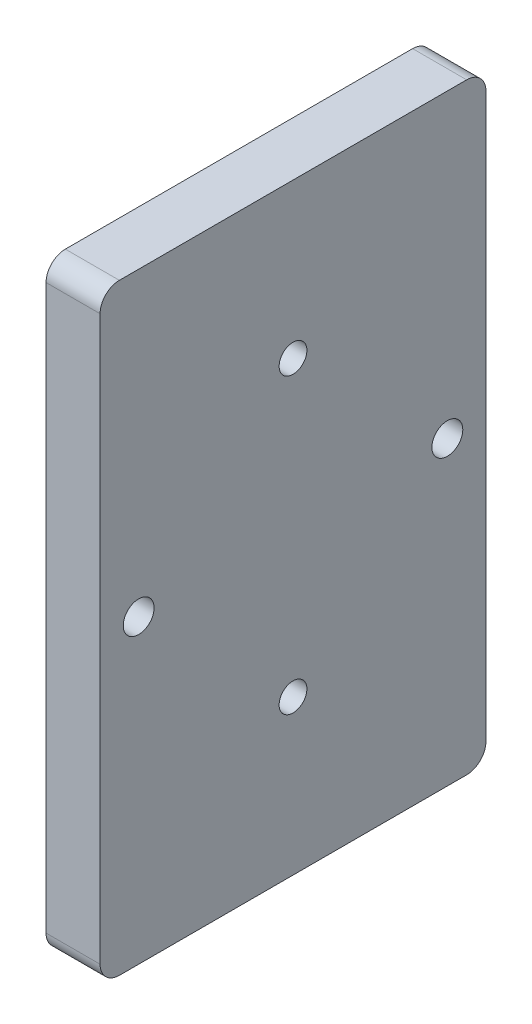
ISO-10303-21;
HEADER;
FILE_DESCRIPTION(('STEP AP214'),'2;1');
FILE_NAME('part.step','',(''),(''),'','','');
FILE_SCHEMA(('AUTOMOTIVE_DESIGN { 1 0 10303 214 1 1 1 1 }'));
ENDSEC;
DATA;
#1=APPLICATION_CONTEXT('core data for automotive mechanical design processes');
#2=APPLICATION_PROTOCOL_DEFINITION('international standard','automotive_design',2000,#1);
#3=PRODUCT_CONTEXT('',#1,'mechanical');
#4=PRODUCT('Part','Part','',(#3));
#5=PRODUCT_RELATED_PRODUCT_CATEGORY('part','',(#4));
#6=PRODUCT_DEFINITION_FORMATION('','',#4);
#7=PRODUCT_DEFINITION_CONTEXT('part definition',#1,'design');
#8=PRODUCT_DEFINITION('design','',#6,#7);
#9=PRODUCT_DEFINITION_SHAPE('','',#8);
#10=(LENGTH_UNIT() NAMED_UNIT(*) SI_UNIT(.MILLI.,.METRE.));
#11=(NAMED_UNIT(*) PLANE_ANGLE_UNIT() SI_UNIT($,.RADIAN.));
#12=(NAMED_UNIT(*) SI_UNIT($,.STERADIAN.) SOLID_ANGLE_UNIT());
#13=UNCERTAINTY_MEASURE_WITH_UNIT(LENGTH_MEASURE(1.E-05),#10,'distance_accuracy_value','');
#14=(GEOMETRIC_REPRESENTATION_CONTEXT(3) GLOBAL_UNCERTAINTY_ASSIGNED_CONTEXT((#13)) GLOBAL_UNIT_ASSIGNED_CONTEXT((#10,
#11,#12)) REPRESENTATION_CONTEXT('',''));
#15=CARTESIAN_POINT('',(0.,0.,0.));
#16=DIRECTION('',(0.,0.,1.));
#17=DIRECTION('',(1.,0.,0.));
#18=AXIS2_PLACEMENT_3D('',#15,#16,#17);
#19=CARTESIAN_POINT('',(14.,0.,0.));
#20=DIRECTION('',(0.,-1.,0.));
#21=DIRECTION('',(0.,0.,-1.));
#22=AXIS2_PLACEMENT_3D('',#19,#20,#21);
#23=PLANE('',#22);
#24=DIRECTION('',(0.,0.,1.));
#25=VECTOR('',#24,1.);
#26=CARTESIAN_POINT('',(14.,0.,0.));
#27=LINE('',#26,#25);
#28=CARTESIAN_POINT('',(14.,0.,-95.));
#29=VERTEX_POINT('',#28);
#30=CARTESIAN_POINT('',(14.,0.,-5.));
#31=VERTEX_POINT('',#30);
#32=EDGE_CURVE('E155',#29,#31,#27,.T.);
#33=ORIENTED_EDGE('',*,*,#32,.T.);
#34=DIRECTION('',(-1.,0.,0.));
#35=VECTOR('',#34,1.);
#36=CARTESIAN_POINT('',(14.,0.,-5.));
#37=LINE('',#36,#35);
#38=CARTESIAN_POINT('',(0.,0.,-5.));
#39=VERTEX_POINT('',#38);
#40=EDGE_CURVE('E11',#31,#39,#37,.T.);
#41=ORIENTED_EDGE('',*,*,#40,.T.);
#42=DIRECTION('',(0.,0.,1.));
#43=VECTOR('',#42,1.);
#44=CARTESIAN_POINT('',(0.,0.,0.));
#45=LINE('',#44,#43);
#46=CARTESIAN_POINT('',(0.,0.,-95.));
#47=VERTEX_POINT('',#46);
#48=EDGE_CURVE('E158',#47,#39,#45,.T.);
#49=ORIENTED_EDGE('',*,*,#48,.F.);
#50=DIRECTION('',(-1.,0.,0.));
#51=VECTOR('',#50,1.);
#52=CARTESIAN_POINT('',(14.,0.,-95.));
#53=LINE('',#52,#51);
#54=EDGE_CURVE('E43',#47,#29,#53,.F.);
#55=ORIENTED_EDGE('',*,*,#54,.T.);
#56=EDGE_LOOP('',(#33,#41,#49,#55));
#57=FACE_BOUND('',#56,.T.);
#58=ADVANCED_FACE('F35',(#57),#23,.T.);
#59=CARTESIAN_POINT('',(14.,0.,-100.));
#60=DIRECTION('',(0.,0.,-1.));
#61=DIRECTION('',(0.,1.,0.));
#62=AXIS2_PLACEMENT_3D('',#59,#60,#61);
#63=PLANE('',#62);
#64=DIRECTION('',(0.,-1.,0.));
#65=VECTOR('',#64,1.);
#66=CARTESIAN_POINT('',(0.,0.,-100.));
#67=LINE('',#66,#65);
#68=CARTESIAN_POINT('',(0.,151.,-100.));
#69=VERTEX_POINT('',#68);
#70=CARTESIAN_POINT('',(0.,5.00000000000001,-100.));
#71=VERTEX_POINT('',#70);
#72=EDGE_CURVE('E121',#69,#71,#67,.T.);
#73=ORIENTED_EDGE('',*,*,#72,.F.);
#74=DIRECTION('',(-1.,0.,0.));
#75=VECTOR('',#74,1.);
#76=CARTESIAN_POINT('',(14.,151.,-100.));
#77=LINE('',#76,#75);
#78=CARTESIAN_POINT('',(14.,151.,-100.));
#79=VERTEX_POINT('',#78);
#80=EDGE_CURVE('E139',#69,#79,#77,.F.);
#81=ORIENTED_EDGE('',*,*,#80,.T.);
#82=DIRECTION('',(0.,-1.,0.));
#83=VECTOR('',#82,1.);
#84=CARTESIAN_POINT('',(14.,0.,-100.));
#85=LINE('',#84,#83);
#86=CARTESIAN_POINT('',(14.,5.00000000000001,-100.));
#87=VERTEX_POINT('',#86);
#88=EDGE_CURVE('E166',#79,#87,#85,.T.);
#89=ORIENTED_EDGE('',*,*,#88,.T.);
#90=DIRECTION('',(-1.,0.,0.));
#91=VECTOR('',#90,1.);
#92=CARTESIAN_POINT('',(14.,5.00000000000001,-100.));
#93=LINE('',#92,#91);
#94=EDGE_CURVE('E136',#87,#71,#93,.T.);
#95=ORIENTED_EDGE('',*,*,#94,.T.);
#96=EDGE_LOOP('',(#73,#81,#89,#95));
#97=FACE_BOUND('',#96,.T.);
#98=ADVANCED_FACE('F173',(#97),#63,.T.);
#99=CARTESIAN_POINT('',(14.,156.,0.));
#100=DIRECTION('',(0.,1.,0.));
#101=DIRECTION('',(0.,0.,1.));
#102=AXIS2_PLACEMENT_3D('',#99,#100,#101);
#103=PLANE('',#102);
#104=DIRECTION('',(0.,0.,-1.));
#105=VECTOR('',#104,1.);
#106=CARTESIAN_POINT('',(14.,156.,0.));
#107=LINE('',#106,#105);
#108=CARTESIAN_POINT('',(14.,156.,-4.99999999999998));
#109=VERTEX_POINT('',#108);
#110=CARTESIAN_POINT('',(14.,156.,-95.));
#111=VERTEX_POINT('',#110);
#112=EDGE_CURVE('E189',#109,#111,#107,.T.);
#113=ORIENTED_EDGE('',*,*,#112,.T.);
#114=DIRECTION('',(-1.,0.,0.));
#115=VECTOR('',#114,1.);
#116=CARTESIAN_POINT('',(14.,156.,-95.));
#117=LINE('',#116,#115);
#118=CARTESIAN_POINT('',(0.,156.,-95.));
#119=VERTEX_POINT('',#118);
#120=EDGE_CURVE('E120',#111,#119,#117,.T.);
#121=ORIENTED_EDGE('',*,*,#120,.T.);
#122=DIRECTION('',(0.,0.,-1.));
#123=VECTOR('',#122,1.);
#124=CARTESIAN_POINT('',(0.,156.,0.));
#125=LINE('',#124,#123);
#126=CARTESIAN_POINT('',(0.,156.,-4.99999999999998));
#127=VERTEX_POINT('',#126);
#128=EDGE_CURVE('E105',#127,#119,#125,.T.);
#129=ORIENTED_EDGE('',*,*,#128,.F.);
#130=DIRECTION('',(-1.,0.,0.));
#131=VECTOR('',#130,1.);
#132=CARTESIAN_POINT('',(14.,156.,-4.99999999999998));
#133=LINE('',#132,#131);
#134=EDGE_CURVE('E118',#127,#109,#133,.F.);
#135=ORIENTED_EDGE('',*,*,#134,.T.);
#136=EDGE_LOOP('',(#113,#121,#129,#135));
#137=FACE_BOUND('',#136,.T.);
#138=ADVANCED_FACE('F117',(#137),#103,.T.);
#139=CARTESIAN_POINT('',(14.,116.,-50.));
#140=DIRECTION('',(-1.,0.,0.));
#141=DIRECTION('',(0.,0.,1.));
#142=AXIS2_PLACEMENT_3D('',#139,#140,#141);
#143=CYLINDRICAL_SURFACE('',#142,3.6);
#144=CARTESIAN_POINT('',(8.,116.,-50.));
#145=DIRECTION('',(1.,0.,0.));
#146=DIRECTION('',(0.,0.,-1.));
#147=AXIS2_PLACEMENT_3D('',#144,#145,#146);
#148=CIRCLE('',#147,3.6);
#149=CARTESIAN_POINT('',(8.,116.,-53.6));
#150=VERTEX_POINT('',#149);
#151=EDGE_CURVE('E200',#150,#150,#148,.T.);
#152=ORIENTED_EDGE('',*,*,#151,.F.);
#153=EDGE_LOOP('',(#152));
#154=FACE_BOUND('',#153,.T.);
#155=CARTESIAN_POINT('',(14.,116.,-50.));
#156=DIRECTION('',(1.,0.,0.));
#157=DIRECTION('',(0.,0.,-1.));
#158=AXIS2_PLACEMENT_3D('',#155,#156,#157);
#159=CIRCLE('',#158,3.6);
#160=CARTESIAN_POINT('',(14.,116.,-53.6));
#161=VERTEX_POINT('',#160);
#162=EDGE_CURVE('E129',#161,#161,#159,.T.);
#163=ORIENTED_EDGE('',*,*,#162,.T.);
#164=EDGE_LOOP('',(#163));
#165=FACE_BOUND('',#164,.T.);
#166=ADVANCED_FACE('F265',(#154,#165),#143,.F.);
#167=CARTESIAN_POINT('',(14.,0.,0.));
#168=DIRECTION('',(0.,0.,1.));
#169=DIRECTION('',(0.,-1.,0.));
#170=AXIS2_PLACEMENT_3D('',#167,#168,#169);
#171=PLANE('',#170);
#172=DIRECTION('',(0.,1.,0.));
#173=VECTOR('',#172,1.);
#174=CARTESIAN_POINT('',(14.,0.,0.));
#175=LINE('',#174,#173);
#176=CARTESIAN_POINT('',(14.,5.,0.));
#177=VERTEX_POINT('',#176);
#178=CARTESIAN_POINT('',(14.,151.,0.));
#179=VERTEX_POINT('',#178);
#180=EDGE_CURVE('E187',#177,#179,#175,.T.);
#181=ORIENTED_EDGE('',*,*,#180,.T.);
#182=DIRECTION('',(-1.,0.,0.));
#183=VECTOR('',#182,1.);
#184=CARTESIAN_POINT('',(14.,151.,0.));
#185=LINE('',#184,#183);
#186=CARTESIAN_POINT('',(0.,151.,0.));
#187=VERTEX_POINT('',#186);
#188=EDGE_CURVE('E149',#179,#187,#185,.T.);
#189=ORIENTED_EDGE('',*,*,#188,.T.);
#190=DIRECTION('',(0.,1.,0.));
#191=VECTOR('',#190,1.);
#192=CARTESIAN_POINT('',(0.,0.,0.));
#193=LINE('',#192,#191);
#194=CARTESIAN_POINT('',(0.,5.,0.));
#195=VERTEX_POINT('',#194);
#196=EDGE_CURVE('E106',#195,#187,#193,.T.);
#197=ORIENTED_EDGE('',*,*,#196,.F.);
#198=DIRECTION('',(-1.,0.,0.));
#199=VECTOR('',#198,1.);
#200=CARTESIAN_POINT('',(14.,5.,0.));
#201=LINE('',#200,#199);
#202=EDGE_CURVE('E57',#195,#177,#201,.F.);
#203=ORIENTED_EDGE('',*,*,#202,.T.);
#204=EDGE_LOOP('',(#181,#189,#197,#203));
#205=FACE_BOUND('',#204,.T.);
#206=ADVANCED_FACE('F248',(#205),#171,.T.);
#207=CARTESIAN_POINT('',(14.,78.,-10.));
#208=DIRECTION('',(-1.,0.,0.));
#209=DIRECTION('',(0.,0.,1.));
#210=AXIS2_PLACEMENT_3D('',#207,#208,#209);
#211=CYLINDRICAL_SURFACE('',#210,4.);
#212=CARTESIAN_POINT('',(14.,78.,-10.));
#213=DIRECTION('',(1.,0.,0.));
#214=DIRECTION('',(0.,0.,-1.));
#215=AXIS2_PLACEMENT_3D('',#212,#213,#214);
#216=CIRCLE('',#215,4.);
#217=CARTESIAN_POINT('',(14.,78.,-14.));
#218=VERTEX_POINT('',#217);
#219=EDGE_CURVE('E167',#218,#218,#216,.T.);
#220=ORIENTED_EDGE('',*,*,#219,.T.);
#221=EDGE_LOOP('',(#220));
#222=FACE_BOUND('',#221,.T.);
#223=CARTESIAN_POINT('',(0.,78.,-10.));
#224=DIRECTION('',(1.,0.,0.));
#225=DIRECTION('',(0.,0.,-1.));
#226=AXIS2_PLACEMENT_3D('',#223,#224,#225);
#227=CIRCLE('',#226,4.);
#228=CARTESIAN_POINT('',(0.,78.,-14.));
#229=VERTEX_POINT('',#228);
#230=EDGE_CURVE('E176',#229,#229,#227,.T.);
#231=ORIENTED_EDGE('',*,*,#230,.F.);
#232=EDGE_LOOP('',(#231));
#233=FACE_BOUND('',#232,.T.);
#234=ADVANCED_FACE('F245',(#222,#233),#211,.F.);
#235=CARTESIAN_POINT('',(14.,78.,-90.));
#236=DIRECTION('',(-1.,0.,0.));
#237=DIRECTION('',(0.,0.,1.));
#238=AXIS2_PLACEMENT_3D('',#235,#236,#237);
#239=CYLINDRICAL_SURFACE('',#238,4.00000000000001);
#240=CARTESIAN_POINT('',(14.,78.,-90.));
#241=DIRECTION('',(1.,0.,0.));
#242=DIRECTION('',(0.,0.,-1.));
#243=AXIS2_PLACEMENT_3D('',#240,#241,#242);
#244=CIRCLE('',#243,4.00000000000001);
#245=CARTESIAN_POINT('',(14.,78.,-94.));
#246=VERTEX_POINT('',#245);
#247=EDGE_CURVE('E194',#246,#246,#244,.T.);
#248=ORIENTED_EDGE('',*,*,#247,.T.);
#249=EDGE_LOOP('',(#248));
#250=FACE_BOUND('',#249,.T.);
#251=CARTESIAN_POINT('',(0.,78.,-90.));
#252=DIRECTION('',(1.,0.,0.));
#253=DIRECTION('',(0.,0.,-1.));
#254=AXIS2_PLACEMENT_3D('',#251,#252,#253);
#255=CIRCLE('',#254,4.00000000000001);
#256=CARTESIAN_POINT('',(0.,78.,-94.));
#257=VERTEX_POINT('',#256);
#258=EDGE_CURVE('E181',#257,#257,#255,.T.);
#259=ORIENTED_EDGE('',*,*,#258,.F.);
#260=EDGE_LOOP('',(#259));
#261=FACE_BOUND('',#260,.T.);
#262=ADVANCED_FACE('F221',(#250,#261),#239,.F.);
#263=CARTESIAN_POINT('',(14.,40.,-50.));
#264=DIRECTION('',(-1.,0.,0.));
#265=DIRECTION('',(0.,0.,1.));
#266=AXIS2_PLACEMENT_3D('',#263,#264,#265);
#267=CYLINDRICAL_SURFACE('',#266,3.6);
#268=CARTESIAN_POINT('',(8.,40.,-50.));
#269=DIRECTION('',(1.,0.,0.));
#270=DIRECTION('',(0.,0.,-1.));
#271=AXIS2_PLACEMENT_3D('',#268,#269,#270);
#272=CIRCLE('',#271,3.6);
#273=CARTESIAN_POINT('',(8.,40.,-53.6));
#274=VERTEX_POINT('',#273);
#275=EDGE_CURVE('E209',#274,#274,#272,.T.);
#276=ORIENTED_EDGE('',*,*,#275,.F.);
#277=EDGE_LOOP('',(#276));
#278=FACE_BOUND('',#277,.T.);
#279=CARTESIAN_POINT('',(14.,40.,-50.));
#280=DIRECTION('',(1.,0.,0.));
#281=DIRECTION('',(0.,0.,-1.));
#282=AXIS2_PLACEMENT_3D('',#279,#280,#281);
#283=CIRCLE('',#282,3.6);
#284=CARTESIAN_POINT('',(14.,40.,-53.6));
#285=VERTEX_POINT('',#284);
#286=EDGE_CURVE('E124',#285,#285,#283,.T.);
#287=ORIENTED_EDGE('',*,*,#286,.T.);
#288=EDGE_LOOP('',(#287));
#289=FACE_BOUND('',#288,.T.);
#290=ADVANCED_FACE('F218',(#278,#289),#267,.F.);
#291=CARTESIAN_POINT('',(14.,0.,0.));
#292=DIRECTION('',(1.,0.,0.));
#293=DIRECTION('',(0.,0.,-1.));
#294=AXIS2_PLACEMENT_3D('',#291,#292,#293);
#295=PLANE('',#294);
#296=ORIENTED_EDGE('',*,*,#247,.F.);
#297=EDGE_LOOP('',(#296));
#298=FACE_BOUND('',#297,.T.);
#299=ORIENTED_EDGE('',*,*,#219,.F.);
#300=EDGE_LOOP('',(#299));
#301=FACE_BOUND('',#300,.T.);
#302=ORIENTED_EDGE('',*,*,#88,.F.);
#303=CARTESIAN_POINT('',(14.,151.,-95.));
#304=DIRECTION('',(1.,0.,0.));
#305=DIRECTION('',(0.,0.,-1.));
#306=AXIS2_PLACEMENT_3D('',#303,#304,#305);
#307=CIRCLE('',#306,5.);
#308=EDGE_CURVE('E146',#79,#111,#307,.T.);
#309=ORIENTED_EDGE('',*,*,#308,.T.);
#310=ORIENTED_EDGE('',*,*,#112,.F.);
#311=CARTESIAN_POINT('',(14.,151.,-4.99999999999998));
#312=DIRECTION('',(1.,0.,0.));
#313=DIRECTION('',(0.,0.,-1.));
#314=AXIS2_PLACEMENT_3D('',#311,#312,#313);
#315=CIRCLE('',#314,5.);
#316=EDGE_CURVE('E50',#109,#179,#315,.T.);
#317=ORIENTED_EDGE('',*,*,#316,.T.);
#318=ORIENTED_EDGE('',*,*,#180,.F.);
#319=CARTESIAN_POINT('',(14.,5.,-5.));
#320=DIRECTION('',(1.,0.,0.));
#321=DIRECTION('',(0.,0.,-1.));
#322=AXIS2_PLACEMENT_3D('',#319,#320,#321);
#323=CIRCLE('',#322,5.);
#324=EDGE_CURVE('E143',#177,#31,#323,.T.);
#325=ORIENTED_EDGE('',*,*,#324,.T.);
#326=ORIENTED_EDGE('',*,*,#32,.F.);
#327=CARTESIAN_POINT('',(14.,5.00000000000001,-95.));
#328=DIRECTION('',(1.,0.,0.));
#329=DIRECTION('',(0.,0.,-1.));
#330=AXIS2_PLACEMENT_3D('',#327,#328,#329);
#331=CIRCLE('',#330,5.);
#332=EDGE_CURVE('E141',#29,#87,#331,.T.);
#333=ORIENTED_EDGE('',*,*,#332,.T.);
#334=EDGE_LOOP('',(#302,#309,#310,#317,#318,#325,#326,#333));
#335=FACE_BOUND('',#334,.T.);
#336=ORIENTED_EDGE('',*,*,#162,.F.);
#337=EDGE_LOOP('',(#336));
#338=FACE_BOUND('',#337,.T.);
#339=ORIENTED_EDGE('',*,*,#286,.F.);
#340=EDGE_LOOP('',(#339));
#341=FACE_BOUND('',#340,.T.);
#342=ADVANCED_FACE('F162',(#298,#301,#335,#338,#341),#295,.T.);
#343=CARTESIAN_POINT('',(0.,0.,0.));
#344=DIRECTION('',(1.,0.,0.));
#345=DIRECTION('',(0.,0.,-1.));
#346=AXIS2_PLACEMENT_3D('',#343,#344,#345);
#347=PLANE('',#346);
#348=CARTESIAN_POINT('',(0.,40.,-50.));
#349=DIRECTION('',(1.,0.,0.));
#350=DIRECTION('',(0.,0.,-1.));
#351=AXIS2_PLACEMENT_3D('',#348,#349,#350);
#352=CIRCLE('',#351,7.);
#353=CARTESIAN_POINT('',(0.,40.,-57.));
#354=VERTEX_POINT('',#353);
#355=EDGE_CURVE('E206',#354,#354,#352,.T.);
#356=ORIENTED_EDGE('',*,*,#355,.T.);
#357=EDGE_LOOP('',(#356));
#358=FACE_BOUND('',#357,.T.);
#359=CARTESIAN_POINT('',(0.,116.,-50.));
#360=DIRECTION('',(1.,0.,0.));
#361=DIRECTION('',(0.,0.,-1.));
#362=AXIS2_PLACEMENT_3D('',#359,#360,#361);
#363=CIRCLE('',#362,7.);
#364=CARTESIAN_POINT('',(0.,116.,-57.));
#365=VERTEX_POINT('',#364);
#366=EDGE_CURVE('E197',#365,#365,#363,.T.);
#367=ORIENTED_EDGE('',*,*,#366,.T.);
#368=EDGE_LOOP('',(#367));
#369=FACE_BOUND('',#368,.T.);
#370=ORIENTED_EDGE('',*,*,#258,.T.);
#371=EDGE_LOOP('',(#370));
#372=FACE_BOUND('',#371,.T.);
#373=ORIENTED_EDGE('',*,*,#230,.T.);
#374=EDGE_LOOP('',(#373));
#375=FACE_BOUND('',#374,.T.);
#376=ORIENTED_EDGE('',*,*,#128,.T.);
#377=CARTESIAN_POINT('',(0.,151.,-95.));
#378=DIRECTION('',(1.,0.,0.));
#379=DIRECTION('',(0.,0.,-1.));
#380=AXIS2_PLACEMENT_3D('',#377,#378,#379);
#381=CIRCLE('',#380,5.);
#382=EDGE_CURVE('E111',#119,#69,#381,.F.);
#383=ORIENTED_EDGE('',*,*,#382,.T.);
#384=ORIENTED_EDGE('',*,*,#72,.T.);
#385=CARTESIAN_POINT('',(0.,5.00000000000001,-95.));
#386=DIRECTION('',(1.,0.,0.));
#387=DIRECTION('',(0.,0.,-1.));
#388=AXIS2_PLACEMENT_3D('',#385,#386,#387);
#389=CIRCLE('',#388,5.);
#390=EDGE_CURVE('E126',#71,#47,#389,.F.);
#391=ORIENTED_EDGE('',*,*,#390,.T.);
#392=ORIENTED_EDGE('',*,*,#48,.T.);
#393=CARTESIAN_POINT('',(0.,5.,-5.));
#394=DIRECTION('',(1.,0.,0.));
#395=DIRECTION('',(0.,0.,-1.));
#396=AXIS2_PLACEMENT_3D('',#393,#394,#395);
#397=CIRCLE('',#396,5.);
#398=EDGE_CURVE('E112',#39,#195,#397,.F.);
#399=ORIENTED_EDGE('',*,*,#398,.T.);
#400=ORIENTED_EDGE('',*,*,#196,.T.);
#401=CARTESIAN_POINT('',(0.,151.,-4.99999999999998));
#402=DIRECTION('',(1.,0.,0.));
#403=DIRECTION('',(0.,0.,-1.));
#404=AXIS2_PLACEMENT_3D('',#401,#402,#403);
#405=CIRCLE('',#404,5.);
#406=EDGE_CURVE('E102',#187,#127,#405,.F.);
#407=ORIENTED_EDGE('',*,*,#406,.T.);
#408=EDGE_LOOP('',(#376,#383,#384,#391,#392,#399,#400,#407));
#409=FACE_BOUND('',#408,.T.);
#410=ADVANCED_FACE('F104',(#358,#369,#372,#375,#409),#347,.F.);
#411=CARTESIAN_POINT('',(14.,151.,-95.));
#412=DIRECTION('',(-1.,0.,0.));
#413=DIRECTION('',(0.,0.,1.));
#414=AXIS2_PLACEMENT_3D('',#411,#412,#413);
#415=CYLINDRICAL_SURFACE('',#414,5.);
#416=ORIENTED_EDGE('',*,*,#308,.F.);
#417=ORIENTED_EDGE('',*,*,#80,.F.);
#418=ORIENTED_EDGE('',*,*,#382,.F.);
#419=ORIENTED_EDGE('',*,*,#120,.F.);
#420=EDGE_LOOP('',(#416,#417,#418,#419));
#421=FACE_BOUND('',#420,.T.);
#422=ADVANCED_FACE('F231',(#421),#415,.T.);
#423=CARTESIAN_POINT('',(14.,151.,-4.99999999999998));
#424=DIRECTION('',(-1.,0.,0.));
#425=DIRECTION('',(0.,0.,1.));
#426=AXIS2_PLACEMENT_3D('',#423,#424,#425);
#427=CYLINDRICAL_SURFACE('',#426,5.);
#428=ORIENTED_EDGE('',*,*,#316,.F.);
#429=ORIENTED_EDGE('',*,*,#134,.F.);
#430=ORIENTED_EDGE('',*,*,#406,.F.);
#431=ORIENTED_EDGE('',*,*,#188,.F.);
#432=EDGE_LOOP('',(#428,#429,#430,#431));
#433=FACE_BOUND('',#432,.T.);
#434=ADVANCED_FACE('F123',(#433),#427,.T.);
#435=CARTESIAN_POINT('',(14.,5.,-5.));
#436=DIRECTION('',(-1.,0.,0.));
#437=DIRECTION('',(0.,0.,1.));
#438=AXIS2_PLACEMENT_3D('',#435,#436,#437);
#439=CYLINDRICAL_SURFACE('',#438,5.);
#440=ORIENTED_EDGE('',*,*,#324,.F.);
#441=ORIENTED_EDGE('',*,*,#202,.F.);
#442=ORIENTED_EDGE('',*,*,#398,.F.);
#443=ORIENTED_EDGE('',*,*,#40,.F.);
#444=EDGE_LOOP('',(#440,#441,#442,#443));
#445=FACE_BOUND('',#444,.T.);
#446=ADVANCED_FACE('F257',(#445),#439,.T.);
#447=CARTESIAN_POINT('',(14.,5.00000000000001,-95.));
#448=DIRECTION('',(-1.,0.,0.));
#449=DIRECTION('',(0.,0.,1.));
#450=AXIS2_PLACEMENT_3D('',#447,#448,#449);
#451=CYLINDRICAL_SURFACE('',#450,5.);
#452=ORIENTED_EDGE('',*,*,#332,.F.);
#453=ORIENTED_EDGE('',*,*,#54,.F.);
#454=ORIENTED_EDGE('',*,*,#390,.F.);
#455=ORIENTED_EDGE('',*,*,#94,.F.);
#456=EDGE_LOOP('',(#452,#453,#454,#455));
#457=FACE_BOUND('',#456,.T.);
#458=ADVANCED_FACE('F37',(#457),#451,.T.);
#459=CARTESIAN_POINT('',(8.,116.,-50.));
#460=DIRECTION('',(-1.,0.,0.));
#461=DIRECTION('',(0.,0.,1.));
#462=AXIS2_PLACEMENT_3D('',#459,#460,#461);
#463=CYLINDRICAL_SURFACE('',#462,7.);
#464=CARTESIAN_POINT('',(8.,116.,-50.));
#465=DIRECTION('',(1.,0.,0.));
#466=DIRECTION('',(0.,0.,-1.));
#467=AXIS2_PLACEMENT_3D('',#464,#465,#466);
#468=CIRCLE('',#467,7.);
#469=CARTESIAN_POINT('',(8.,116.,-57.));
#470=VERTEX_POINT('',#469);
#471=EDGE_CURVE('E183',#470,#470,#468,.T.);
#472=ORIENTED_EDGE('',*,*,#471,.T.);
#473=EDGE_LOOP('',(#472));
#474=FACE_BOUND('',#473,.T.);
#475=ORIENTED_EDGE('',*,*,#366,.F.);
#476=EDGE_LOOP('',(#475));
#477=FACE_BOUND('',#476,.T.);
#478=ADVANCED_FACE('F263',(#474,#477),#463,.F.);
#479=CARTESIAN_POINT('',(8.,0.,0.));
#480=DIRECTION('',(1.,0.,0.));
#481=DIRECTION('',(0.,0.,-1.));
#482=AXIS2_PLACEMENT_3D('',#479,#480,#481);
#483=PLANE('',#482);
#484=ORIENTED_EDGE('',*,*,#151,.T.);
#485=EDGE_LOOP('',(#484));
#486=FACE_BOUND('',#485,.T.);
#487=ORIENTED_EDGE('',*,*,#471,.F.);
#488=EDGE_LOOP('',(#487));
#489=FACE_BOUND('',#488,.T.);
#490=ADVANCED_FACE('F310',(#486,#489),#483,.F.);
#491=CARTESIAN_POINT('',(8.,40.,-50.));
#492=DIRECTION('',(-1.,0.,0.));
#493=DIRECTION('',(0.,0.,1.));
#494=AXIS2_PLACEMENT_3D('',#491,#492,#493);
#495=CYLINDRICAL_SURFACE('',#494,7.);
#496=CARTESIAN_POINT('',(8.,40.,-50.));
#497=DIRECTION('',(1.,0.,0.));
#498=DIRECTION('',(0.,0.,-1.));
#499=AXIS2_PLACEMENT_3D('',#496,#497,#498);
#500=CIRCLE('',#499,7.);
#501=CARTESIAN_POINT('',(8.,40.,-57.));
#502=VERTEX_POINT('',#501);
#503=EDGE_CURVE('E201',#502,#502,#500,.T.);
#504=ORIENTED_EDGE('',*,*,#503,.T.);
#505=EDGE_LOOP('',(#504));
#506=FACE_BOUND('',#505,.T.);
#507=ORIENTED_EDGE('',*,*,#355,.F.);
#508=EDGE_LOOP('',(#507));
#509=FACE_BOUND('',#508,.T.);
#510=ADVANCED_FACE('F319',(#506,#509),#495,.F.);
#511=CARTESIAN_POINT('',(8.,0.,0.));
#512=DIRECTION('',(1.,0.,0.));
#513=DIRECTION('',(0.,0.,-1.));
#514=AXIS2_PLACEMENT_3D('',#511,#512,#513);
#515=PLANE('',#514);
#516=ORIENTED_EDGE('',*,*,#275,.T.);
#517=EDGE_LOOP('',(#516));
#518=FACE_BOUND('',#517,.T.);
#519=ORIENTED_EDGE('',*,*,#503,.F.);
#520=EDGE_LOOP('',(#519));
#521=FACE_BOUND('',#520,.T.);
#522=ADVANCED_FACE('F215',(#518,#521),#515,.F.);
#523=CLOSED_SHELL('',(#58,#98,#138,#166,#206,#234,#262,#290,#342,#410,#422,#434,#446,#458,#478,
#490,#510,#522));
#524=MANIFOLD_SOLID_BREP('B2',#523);
#525=ADVANCED_BREP_SHAPE_REPRESENTATION('',(#18,#524),#14);
#526=SHAPE_DEFINITION_REPRESENTATION(#9,#525);
ENDSEC;
END-ISO-10303-21;
